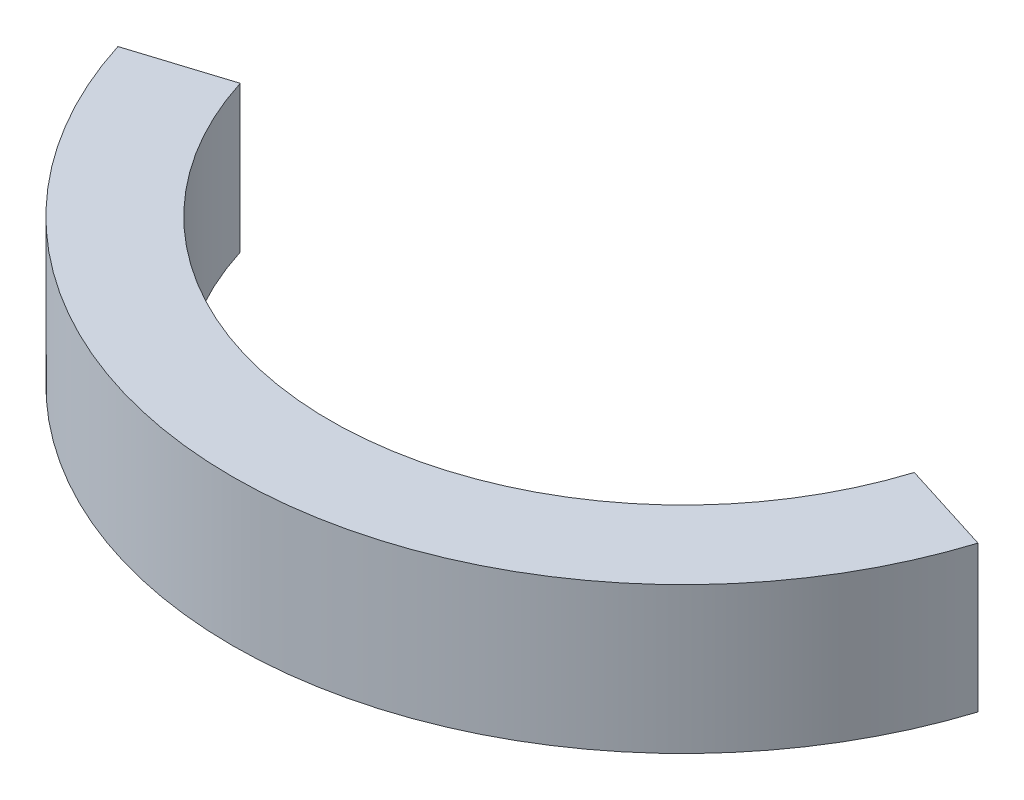
ISO-10303-21;
HEADER;
FILE_DESCRIPTION(('STEP AP214'),'2;1');
FILE_NAME('part.step','',(''),(''),'','','');
FILE_SCHEMA(('AUTOMOTIVE_DESIGN { 1 0 10303 214 1 1 1 1 }'));
ENDSEC;
DATA;
#1=APPLICATION_CONTEXT('core data for automotive mechanical design processes');
#2=APPLICATION_PROTOCOL_DEFINITION('international standard','automotive_design',2000,#1);
#3=PRODUCT_CONTEXT('',#1,'mechanical');
#4=PRODUCT('Part','Part','',(#3));
#5=PRODUCT_RELATED_PRODUCT_CATEGORY('part','',(#4));
#6=PRODUCT_DEFINITION_FORMATION('','',#4);
#7=PRODUCT_DEFINITION_CONTEXT('part definition',#1,'design');
#8=PRODUCT_DEFINITION('design','',#6,#7);
#9=PRODUCT_DEFINITION_SHAPE('','',#8);
#10=(LENGTH_UNIT() NAMED_UNIT(*) SI_UNIT(.MILLI.,.METRE.));
#11=(NAMED_UNIT(*) PLANE_ANGLE_UNIT() SI_UNIT($,.RADIAN.));
#12=(NAMED_UNIT(*) SI_UNIT($,.STERADIAN.) SOLID_ANGLE_UNIT());
#13=UNCERTAINTY_MEASURE_WITH_UNIT(LENGTH_MEASURE(1.E-05),#10,'distance_accuracy_value','');
#14=(GEOMETRIC_REPRESENTATION_CONTEXT(3) GLOBAL_UNCERTAINTY_ASSIGNED_CONTEXT((#13)) GLOBAL_UNIT_ASSIGNED_CONTEXT((#10,
#11,#12)) REPRESENTATION_CONTEXT('',''));
#15=CARTESIAN_POINT('',(0.,0.,0.));
#16=DIRECTION('',(0.,0.,1.));
#17=DIRECTION('',(1.,0.,0.));
#18=AXIS2_PLACEMENT_3D('',#15,#16,#17);
#19=CARTESIAN_POINT('',(0.,-38.1,0.));
#20=DIRECTION('',(0.,1.,0.));
#21=DIRECTION('',(0.,0.,1.));
#22=AXIS2_PLACEMENT_3D('',#19,#20,#21);
#23=CYLINDRICAL_SURFACE('',#22,117.475);
#24=CARTESIAN_POINT('',(0.,0.,0.));
#25=DIRECTION('',(0.,1.,0.));
#26=DIRECTION('',(0.,0.,1.));
#27=AXIS2_PLACEMENT_3D('',#24,#25,#26);
#28=CIRCLE('',#27,117.475);
#29=CARTESIAN_POINT('',(-112.037898789148,0.,35.3254137967646));
#30=VERTEX_POINT('',#29);
#31=CARTESIAN_POINT('',(112.037898789148,0.,35.3254137967645));
#32=VERTEX_POINT('',#31);
#33=EDGE_CURVE('E97',#30,#32,#28,.T.);
#34=ORIENTED_EDGE('',*,*,#33,.F.);
#35=DIRECTION('',(0.,1.,0.));
#36=VECTOR('',#35,1.);
#37=CARTESIAN_POINT('',(-112.037898789148,-38.1,35.3254137967646));
#38=LINE('',#37,#36);
#39=CARTESIAN_POINT('',(-112.037898789148,-38.1,35.3254137967646));
#40=VERTEX_POINT('',#39);
#41=EDGE_CURVE('E11',#40,#30,#38,.T.);
#42=ORIENTED_EDGE('',*,*,#41,.F.);
#43=CARTESIAN_POINT('',(0.,-38.1,0.));
#44=DIRECTION('',(0.,1.,0.));
#45=DIRECTION('',(0.,0.,1.));
#46=AXIS2_PLACEMENT_3D('',#43,#44,#45);
#47=CIRCLE('',#46,117.475);
#48=CARTESIAN_POINT('',(112.037898789148,-38.1,35.3254137967645));
#49=VERTEX_POINT('',#48);
#50=EDGE_CURVE('E91',#40,#49,#47,.T.);
#51=ORIENTED_EDGE('',*,*,#50,.T.);
#52=DIRECTION('',(0.,1.,0.));
#53=VECTOR('',#52,1.);
#54=CARTESIAN_POINT('',(112.037898789148,-38.1,35.3254137967645));
#55=LINE('',#54,#53);
#56=EDGE_CURVE('E36',#49,#32,#55,.T.);
#57=ORIENTED_EDGE('',*,*,#56,.T.);
#58=EDGE_LOOP('',(#34,#42,#51,#57));
#59=FACE_BOUND('',#58,.T.);
#60=ADVANCED_FACE('F33',(#59),#23,.T.);
#61=CARTESIAN_POINT('',(-112.037898789148,-38.1,35.3254137967646));
#62=DIRECTION('',(-0.300705799504275,0.,-0.953716950748226));
#63=DIRECTION('',(-0.953716950748226,0.,0.300705799504275));
#64=AXIS2_PLACEMENT_3D('',#61,#62,#63);
#65=PLANE('',#64);
#66=DIRECTION('',(-0.953716950748226,0.,0.300705799504275));
#67=VECTOR('',#66,1.);
#68=CARTESIAN_POINT('',(-112.037898789148,0.,35.3254137967646));
#69=LINE('',#68,#67);
#70=CARTESIAN_POINT('',(-87.813488240143,0.,27.687486489356));
#71=VERTEX_POINT('',#70);
#72=EDGE_CURVE('E93',#71,#30,#69,.T.);
#73=ORIENTED_EDGE('',*,*,#72,.F.);
#74=DIRECTION('',(0.,1.,0.));
#75=VECTOR('',#74,1.);
#76=CARTESIAN_POINT('',(-87.813488240143,-38.1,27.687486489356));
#77=LINE('',#76,#75);
#78=CARTESIAN_POINT('',(-87.813488240143,-38.1,27.687486489356));
#79=VERTEX_POINT('',#78);
#80=EDGE_CURVE('E42',#79,#71,#77,.T.);
#81=ORIENTED_EDGE('',*,*,#80,.F.);
#82=DIRECTION('',(-0.953716950748226,0.,0.300705799504275));
#83=VECTOR('',#82,1.);
#84=CARTESIAN_POINT('',(-112.037898789148,-38.1,35.3254137967646));
#85=LINE('',#84,#83);
#86=EDGE_CURVE('E88',#79,#40,#85,.T.);
#87=ORIENTED_EDGE('',*,*,#86,.T.);
#88=ORIENTED_EDGE('',*,*,#41,.T.);
#89=EDGE_LOOP('',(#73,#81,#87,#88));
#90=FACE_BOUND('',#89,.T.);
#91=ADVANCED_FACE('F107',(#90),#65,.T.);
#92=CARTESIAN_POINT('',(0.,-38.1,0.));
#93=DIRECTION('',(0.,1.,0.));
#94=DIRECTION('',(0.,0.,1.));
#95=AXIS2_PLACEMENT_3D('',#92,#93,#94);
#96=CYLINDRICAL_SURFACE('',#95,92.075);
#97=CARTESIAN_POINT('',(0.,0.,0.));
#98=DIRECTION('',(0.,-1.,0.));
#99=DIRECTION('',(0.,0.,1.));
#100=AXIS2_PLACEMENT_3D('',#97,#98,#99);
#101=CIRCLE('',#100,92.075);
#102=CARTESIAN_POINT('',(87.813488240143,0.,27.687486489356));
#103=VERTEX_POINT('',#102);
#104=EDGE_CURVE('E83',#103,#71,#101,.T.);
#105=ORIENTED_EDGE('',*,*,#104,.F.);
#106=DIRECTION('',(0.,1.,0.));
#107=VECTOR('',#106,1.);
#108=CARTESIAN_POINT('',(87.813488240143,-38.1,27.687486489356));
#109=LINE('',#108,#107);
#110=CARTESIAN_POINT('',(87.813488240143,-38.1,27.687486489356));
#111=VERTEX_POINT('',#110);
#112=EDGE_CURVE('E78',#111,#103,#109,.T.);
#113=ORIENTED_EDGE('',*,*,#112,.F.);
#114=CARTESIAN_POINT('',(0.,-38.1,0.));
#115=DIRECTION('',(0.,-1.,0.));
#116=DIRECTION('',(0.,0.,1.));
#117=AXIS2_PLACEMENT_3D('',#114,#115,#116);
#118=CIRCLE('',#117,92.075);
#119=EDGE_CURVE('E81',#111,#79,#118,.T.);
#120=ORIENTED_EDGE('',*,*,#119,.T.);
#121=ORIENTED_EDGE('',*,*,#80,.T.);
#122=EDGE_LOOP('',(#105,#113,#120,#121));
#123=FACE_BOUND('',#122,.T.);
#124=ADVANCED_FACE('F80',(#123),#96,.F.);
#125=CARTESIAN_POINT('',(87.813488240143,-38.1,27.687486489356));
#126=DIRECTION('',(0.300705799504273,0.,-0.953716950748227));
#127=DIRECTION('',(-0.953716950748227,0.,-0.300705799504273));
#128=AXIS2_PLACEMENT_3D('',#125,#126,#127);
#129=PLANE('',#128);
#130=DIRECTION('',(-0.953716950748227,0.,-0.300705799504273));
#131=VECTOR('',#130,1.);
#132=CARTESIAN_POINT('',(87.813488240143,0.,27.687486489356));
#133=LINE('',#132,#131);
#134=EDGE_CURVE('E100',#32,#103,#133,.T.);
#135=ORIENTED_EDGE('',*,*,#134,.F.);
#136=ORIENTED_EDGE('',*,*,#56,.F.);
#137=DIRECTION('',(-0.953716950748227,0.,-0.300705799504273));
#138=VECTOR('',#137,1.);
#139=CARTESIAN_POINT('',(87.813488240143,-38.1,27.687486489356));
#140=LINE('',#139,#138);
#141=EDGE_CURVE('E87',#49,#111,#140,.T.);
#142=ORIENTED_EDGE('',*,*,#141,.T.);
#143=ORIENTED_EDGE('',*,*,#112,.T.);
#144=EDGE_LOOP('',(#135,#136,#142,#143));
#145=FACE_BOUND('',#144,.T.);
#146=ADVANCED_FACE('F90',(#145),#129,.T.);
#147=CARTESIAN_POINT('',(0.,-38.1,0.));
#148=DIRECTION('',(0.,1.,0.));
#149=DIRECTION('',(0.,0.,1.));
#150=AXIS2_PLACEMENT_3D('',#147,#148,#149);
#151=PLANE('',#150);
#152=ORIENTED_EDGE('',*,*,#50,.F.);
#153=ORIENTED_EDGE('',*,*,#86,.F.);
#154=ORIENTED_EDGE('',*,*,#119,.F.);
#155=ORIENTED_EDGE('',*,*,#141,.F.);
#156=EDGE_LOOP('',(#152,#153,#154,#155));
#157=FACE_BOUND('',#156,.T.);
#158=ADVANCED_FACE('F86',(#157),#151,.F.);
#159=CARTESIAN_POINT('',(0.,0.,0.));
#160=DIRECTION('',(0.,1.,0.));
#161=DIRECTION('',(0.,0.,1.));
#162=AXIS2_PLACEMENT_3D('',#159,#160,#161);
#163=PLANE('',#162);
#164=ORIENTED_EDGE('',*,*,#33,.T.);
#165=ORIENTED_EDGE('',*,*,#134,.T.);
#166=ORIENTED_EDGE('',*,*,#104,.T.);
#167=ORIENTED_EDGE('',*,*,#72,.T.);
#168=EDGE_LOOP('',(#164,#165,#166,#167));
#169=FACE_BOUND('',#168,.T.);
#170=ADVANCED_FACE('F106',(#169),#163,.T.);
#171=CLOSED_SHELL('',(#60,#91,#124,#146,#158,#170));
#172=MANIFOLD_SOLID_BREP('B2',#171);
#173=ADVANCED_BREP_SHAPE_REPRESENTATION('',(#18,#172),#14);
#174=SHAPE_DEFINITION_REPRESENTATION(#9,#173);
ENDSEC;
END-ISO-10303-21;
